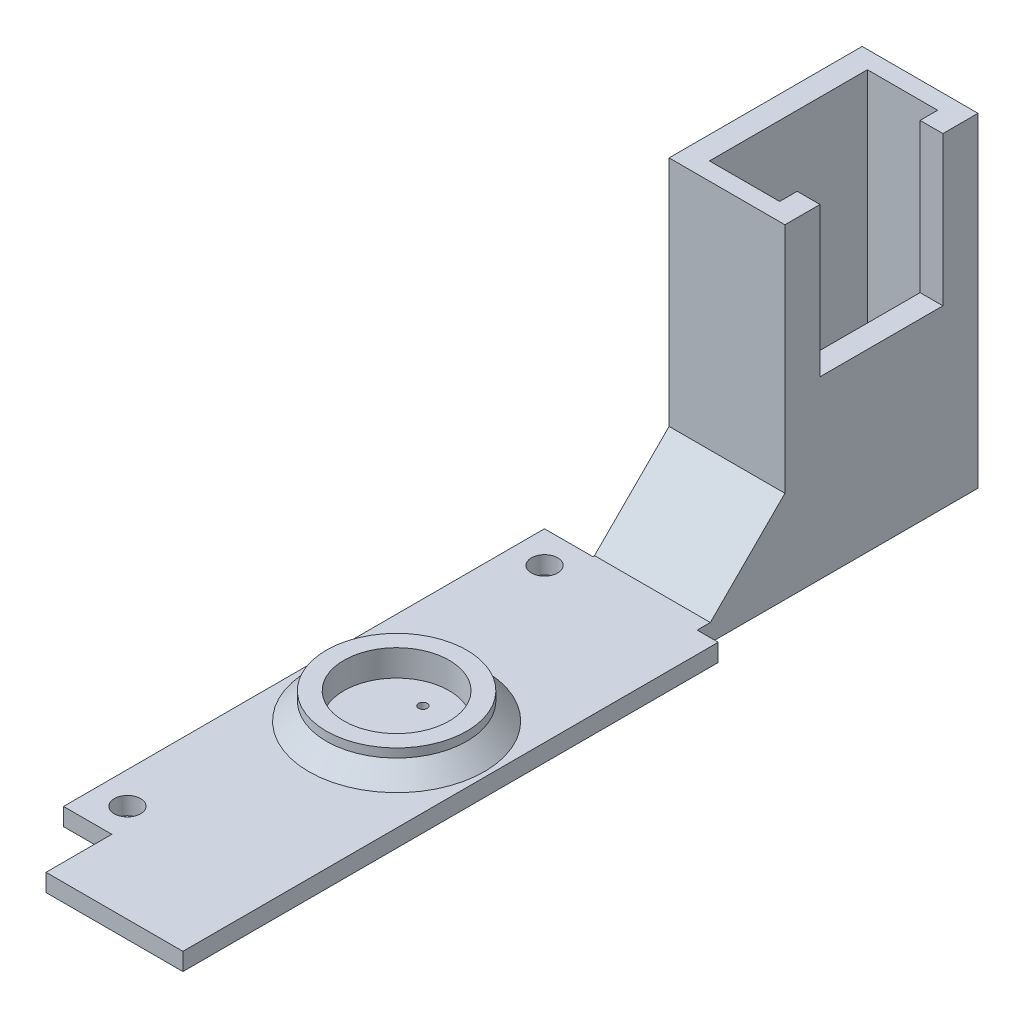
ISO-10303-21;
HEADER;
FILE_DESCRIPTION(('STEP AP214'),'2;1');
FILE_NAME('part.step','',(''),(''),'','','');
FILE_SCHEMA(('AUTOMOTIVE_DESIGN { 1 0 10303 214 1 1 1 1 }'));
ENDSEC;
DATA;
#1=APPLICATION_CONTEXT('core data for automotive mechanical design processes');
#2=APPLICATION_PROTOCOL_DEFINITION('international standard','automotive_design',2000,#1);
#3=PRODUCT_CONTEXT('',#1,'mechanical');
#4=PRODUCT('Part','Part','',(#3));
#5=PRODUCT_RELATED_PRODUCT_CATEGORY('part','',(#4));
#6=PRODUCT_DEFINITION_FORMATION('','',#4);
#7=PRODUCT_DEFINITION_CONTEXT('part definition',#1,'design');
#8=PRODUCT_DEFINITION('design','',#6,#7);
#9=PRODUCT_DEFINITION_SHAPE('','',#8);
#10=(LENGTH_UNIT() NAMED_UNIT(*) SI_UNIT(.MILLI.,.METRE.));
#11=(NAMED_UNIT(*) PLANE_ANGLE_UNIT() SI_UNIT($,.RADIAN.));
#12=(NAMED_UNIT(*) SI_UNIT($,.STERADIAN.) SOLID_ANGLE_UNIT());
#13=UNCERTAINTY_MEASURE_WITH_UNIT(LENGTH_MEASURE(1.E-05),#10,'distance_accuracy_value','');
#14=(GEOMETRIC_REPRESENTATION_CONTEXT(3) GLOBAL_UNCERTAINTY_ASSIGNED_CONTEXT((#13)) GLOBAL_UNIT_ASSIGNED_CONTEXT((#10,
#11,#12)) REPRESENTATION_CONTEXT('',''));
#15=CARTESIAN_POINT('',(0.,0.,0.));
#16=DIRECTION('',(0.,0.,1.));
#17=DIRECTION('',(1.,0.,0.));
#18=AXIS2_PLACEMENT_3D('',#15,#16,#17);
#19=CARTESIAN_POINT('',(0.,23.5,0.));
#20=DIRECTION('',(0.,1.,0.));
#21=DIRECTION('',(0.,0.,1.));
#22=AXIS2_PLACEMENT_3D('',#19,#20,#21);
#23=PLANE('',#22);
#24=CARTESIAN_POINT('',(-54.95,23.5,-6.40000000000002));
#25=DIRECTION('',(0.,1.,0.));
#26=DIRECTION('',(0.,0.,-1.));
#27=AXIS2_PLACEMENT_3D('',#24,#25,#26);
#28=CIRCLE('',#27,0.499999999999999);
#29=CARTESIAN_POINT('',(-54.95,23.5,-6.90000000000002));
#30=VERTEX_POINT('',#29);
#31=EDGE_CURVE('E562',#30,#30,#28,.T.);
#32=ORIENTED_EDGE('',*,*,#31,.F.);
#33=EDGE_LOOP('',(#32));
#34=FACE_BOUND('',#33,.T.);
#35=CARTESIAN_POINT('',(-54.95,23.5,-12.4));
#36=DIRECTION('',(0.,1.,0.));
#37=DIRECTION('',(0.,0.,1.));
#38=AXIS2_PLACEMENT_3D('',#35,#36,#37);
#39=CIRCLE('',#38,0.499999999999999);
#40=CARTESIAN_POINT('',(-54.95,23.5,-11.9));
#41=VERTEX_POINT('',#40);
#42=EDGE_CURVE('E561',#41,#41,#39,.T.);
#43=ORIENTED_EDGE('',*,*,#42,.F.);
#44=EDGE_LOOP('',(#43));
#45=FACE_BOUND('',#44,.T.);
#46=CARTESIAN_POINT('',(-54.95,23.5,-9.40000000000002));
#47=DIRECTION('',(0.,1.,0.));
#48=DIRECTION('',(0.,0.,1.));
#49=AXIS2_PLACEMENT_3D('',#46,#47,#48);
#50=CIRCLE('',#49,6.);
#51=CARTESIAN_POINT('',(-54.95,23.5,-3.40000000000002));
#52=VERTEX_POINT('',#51);
#53=EDGE_CURVE('E386',#52,#52,#50,.F.);
#54=ORIENTED_EDGE('',*,*,#53,.F.);
#55=EDGE_LOOP('',(#54));
#56=FACE_BOUND('',#55,.T.);
#57=ADVANCED_FACE('F39',(#34,#45,#56),#23,.T.);
#58=DIRECTION('',(1.,0.,0.));
#59=VECTOR('',#58,1.);
#60=CARTESIAN_POINT('',(-57.4,23.5,-50.5));
#61=LINE('',#60,#59);
#62=CARTESIAN_POINT('',(-57.4,23.5,-50.5));
#63=VERTEX_POINT('',#62);
#64=CARTESIAN_POINT('',(-49.4,23.5,-50.5));
#65=VERTEX_POINT('',#64);
#66=EDGE_CURVE('E237',#63,#65,#61,.T.);
#67=ORIENTED_EDGE('',*,*,#66,.F.);
#68=DIRECTION('',(0.,0.,1.));
#69=VECTOR('',#68,1.);
#70=CARTESIAN_POINT('',(-57.4,23.5,-65.5));
#71=LINE('',#70,#69);
#72=CARTESIAN_POINT('',(-57.4,23.5,-47.5));
#73=VERTEX_POINT('',#72);
#74=EDGE_CURVE('E262',#63,#73,#71,.T.);
#75=ORIENTED_EDGE('',*,*,#74,.T.);
#76=DIRECTION('',(1.,0.,0.));
#77=VECTOR('',#76,1.);
#78=CARTESIAN_POINT('',(-53.4,23.5,-47.5));
#79=LINE('',#78,#77);
#80=CARTESIAN_POINT('',(-49.4,23.5,-47.5));
#81=VERTEX_POINT('',#80);
#82=EDGE_CURVE('E266',#73,#81,#79,.T.);
#83=ORIENTED_EDGE('',*,*,#82,.T.);
#84=DIRECTION('',(0.,0.,-1.));
#85=VECTOR('',#84,1.);
#86=CARTESIAN_POINT('',(-49.4,23.5,-65.5));
#87=LINE('',#86,#85);
#88=EDGE_CURVE('E259',#81,#65,#87,.T.);
#89=ORIENTED_EDGE('',*,*,#88,.T.);
#90=EDGE_LOOP('',(#67,#75,#83,#89));
#91=FACE_BOUND('',#90,.T.);
#92=ADVANCED_FACE('F404',(#91),#23,.T.);
#93=CARTESIAN_POINT('',(44.8,21.5,-42.5));
#94=DIRECTION('',(0.,-1.,0.));
#95=DIRECTION('',(0.,0.,-1.));
#96=AXIS2_PLACEMENT_3D('',#93,#94,#95);
#97=PLANE('',#96);
#98=CARTESIAN_POINT('',(-54.95,21.5,-12.4));
#99=DIRECTION('',(0.,-1.,0.));
#100=DIRECTION('',(0.,0.,-1.));
#101=AXIS2_PLACEMENT_3D('',#98,#99,#100);
#102=CIRCLE('',#101,0.499999999999999);
#103=CARTESIAN_POINT('',(-54.95,21.5,-12.9));
#104=VERTEX_POINT('',#103);
#105=EDGE_CURVE('E542',#104,#104,#102,.T.);
#106=ORIENTED_EDGE('',*,*,#105,.F.);
#107=EDGE_LOOP('',(#106));
#108=FACE_BOUND('',#107,.T.);
#109=CARTESIAN_POINT('',(-54.95,21.5,-6.40000000000002));
#110=DIRECTION('',(0.,-1.,0.));
#111=DIRECTION('',(0.,0.,-1.));
#112=AXIS2_PLACEMENT_3D('',#109,#110,#111);
#113=CIRCLE('',#112,0.499999999999999);
#114=CARTESIAN_POINT('',(-54.95,21.5,-6.90000000000002));
#115=VERTEX_POINT('',#114);
#116=EDGE_CURVE('E558',#115,#115,#113,.T.);
#117=ORIENTED_EDGE('',*,*,#116,.F.);
#118=EDGE_LOOP('',(#117));
#119=FACE_BOUND('',#118,.T.);
#120=DIRECTION('',(0.,0.,-1.));
#121=VECTOR('',#120,1.);
#122=CARTESIAN_POINT('',(-57.4,21.5,-42.5));
#123=LINE('',#122,#121);
#124=CARTESIAN_POINT('',(-57.4,21.5,-50.5));
#125=VERTEX_POINT('',#124);
#126=CARTESIAN_POINT('',(-57.4,21.5,-62.5));
#127=VERTEX_POINT('',#126);
#128=EDGE_CURVE('E377',#125,#127,#123,.T.);
#129=ORIENTED_EDGE('',*,*,#128,.F.);
#130=DIRECTION('',(-1.,0.,0.));
#131=VECTOR('',#130,1.);
#132=CARTESIAN_POINT('',(44.8,21.5,-50.5));
#133=LINE('',#132,#131);
#134=CARTESIAN_POINT('',(-49.4,21.5,-50.5));
#135=VERTEX_POINT('',#134);
#136=EDGE_CURVE('E291',#135,#125,#133,.T.);
#137=ORIENTED_EDGE('',*,*,#136,.F.);
#138=DIRECTION('',(0.,0.,1.));
#139=VECTOR('',#138,1.);
#140=CARTESIAN_POINT('',(-49.4,21.5,-42.5));
#141=LINE('',#140,#139);
#142=CARTESIAN_POINT('',(-49.4,21.5,-62.5));
#143=VERTEX_POINT('',#142);
#144=EDGE_CURVE('E372',#143,#135,#141,.T.);
#145=ORIENTED_EDGE('',*,*,#144,.F.);
#146=DIRECTION('',(1.,0.,0.));
#147=VECTOR('',#146,1.);
#148=CARTESIAN_POINT('',(44.8,21.5,-62.5));
#149=LINE('',#148,#147);
#150=EDGE_CURVE('E375',#127,#143,#149,.T.);
#151=ORIENTED_EDGE('',*,*,#150,.F.);
#152=EDGE_LOOP('',(#129,#137,#145,#151));
#153=FACE_BOUND('',#152,.T.);
#154=DIRECTION('',(1.,0.,0.));
#155=VECTOR('',#154,1.);
#156=CARTESIAN_POINT('',(-65.5,21.5,18.));
#157=LINE('',#156,#155);
#158=CARTESIAN_POINT('',(-65.5,21.5,18.));
#159=VERTEX_POINT('',#158);
#160=CARTESIAN_POINT('',(-60.,21.5,18.));
#161=VERTEX_POINT('',#160);
#162=EDGE_CURVE('E305',#159,#161,#157,.T.);
#163=ORIENTED_EDGE('',*,*,#162,.F.);
#164=DIRECTION('',(0.,0.,1.));
#165=VECTOR('',#164,1.);
#166=CARTESIAN_POINT('',(-65.5,21.5,-36.8));
#167=LINE('',#166,#165);
#168=CARTESIAN_POINT('',(-65.5,21.5,-36.8));
#169=VERTEX_POINT('',#168);
#170=EDGE_CURVE('E316',#169,#159,#167,.T.);
#171=ORIENTED_EDGE('',*,*,#170,.F.);
#172=DIRECTION('',(-1.,0.,0.));
#173=VECTOR('',#172,1.);
#174=CARTESIAN_POINT('',(-60.,21.5,-36.8));
#175=LINE('',#174,#173);
#176=CARTESIAN_POINT('',(-60.,21.5,-36.8));
#177=VERTEX_POINT('',#176);
#178=EDGE_CURVE('E314',#177,#169,#175,.T.);
#179=ORIENTED_EDGE('',*,*,#178,.F.);
#180=DIRECTION('',(0.,0.,1.));
#181=VECTOR('',#180,1.);
#182=CARTESIAN_POINT('',(-60.,21.5,-67.5));
#183=LINE('',#182,#181);
#184=CARTESIAN_POINT('',(-60.,21.5,-67.5));
#185=VERTEX_POINT('',#184);
#186=EDGE_CURVE('E312',#185,#177,#183,.T.);
#187=ORIENTED_EDGE('',*,*,#186,.F.);
#188=DIRECTION('',(-1.,0.,0.));
#189=VECTOR('',#188,1.);
#190=CARTESIAN_POINT('',(-55.3,21.5,-67.5));
#191=LINE('',#190,#189);
#192=CARTESIAN_POINT('',(-46.8,21.5,-67.5));
#193=VERTEX_POINT('',#192);
#194=EDGE_CURVE('E310',#193,#185,#191,.T.);
#195=ORIENTED_EDGE('',*,*,#194,.F.);
#196=DIRECTION('',(0.,0.,1.));
#197=VECTOR('',#196,1.);
#198=CARTESIAN_POINT('',(-46.8,21.5,-62.8));
#199=LINE('',#198,#197);
#200=CARTESIAN_POINT('',(-46.8,21.5,-35.5));
#201=VERTEX_POINT('',#200);
#202=EDGE_CURVE('E295',#193,#201,#199,.T.);
#203=ORIENTED_EDGE('',*,*,#202,.T.);
#204=DIRECTION('',(-1.,0.,0.));
#205=VECTOR('',#204,1.);
#206=CARTESIAN_POINT('',(-44.4,21.5,-35.5));
#207=LINE('',#206,#205);
#208=CARTESIAN_POINT('',(-44.4,21.5,-35.5));
#209=VERTEX_POINT('',#208);
#210=EDGE_CURVE('E299',#209,#201,#207,.T.);
#211=ORIENTED_EDGE('',*,*,#210,.F.);
#212=DIRECTION('',(0.,0.,-1.));
#213=VECTOR('',#212,1.);
#214=CARTESIAN_POINT('',(-44.4,21.5,-29.3));
#215=LINE('',#214,#213);
#216=CARTESIAN_POINT('',(-44.4,21.5,25.5));
#217=VERTEX_POINT('',#216);
#218=EDGE_CURVE('E303',#217,#209,#215,.T.);
#219=ORIENTED_EDGE('',*,*,#218,.F.);
#220=DIRECTION('',(1.,0.,0.));
#221=VECTOR('',#220,1.);
#222=CARTESIAN_POINT('',(-16.9,21.5,25.5));
#223=LINE('',#222,#221);
#224=CARTESIAN_POINT('',(-60.,21.5,25.5));
#225=VERTEX_POINT('',#224);
#226=EDGE_CURVE('E296',#225,#217,#223,.T.);
#227=ORIENTED_EDGE('',*,*,#226,.F.);
#228=DIRECTION('',(0.,0.,1.));
#229=VECTOR('',#228,1.);
#230=CARTESIAN_POINT('',(-60.,21.5,18.));
#231=LINE('',#230,#229);
#232=EDGE_CURVE('E307',#161,#225,#231,.T.);
#233=ORIENTED_EDGE('',*,*,#232,.F.);
#234=EDGE_LOOP('',(#163,#171,#179,#187,#195,#203,#211,#219,#227,#233));
#235=FACE_BOUND('',#234,.T.);
#236=CARTESIAN_POINT('',(-61.8792707762021,21.5,-33.1911439682998));
#237=DIRECTION('',(0.,1.,0.));
#238=DIRECTION('',(0.,0.,1.));
#239=AXIS2_PLACEMENT_3D('',#236,#237,#238);
#240=CIRCLE('',#239,1.5);
#241=CARTESIAN_POINT('',(-61.8792707762021,21.5,-31.6911439682998));
#242=VERTEX_POINT('',#241);
#243=EDGE_CURVE('E292',#242,#242,#240,.T.);
#244=ORIENTED_EDGE('',*,*,#243,.T.);
#245=EDGE_LOOP('',(#244));
#246=FACE_BOUND('',#245,.T.);
#247=CARTESIAN_POINT('',(-61.8792707762021,21.5,14.3376182989599));
#248=DIRECTION('',(0.,1.,0.));
#249=DIRECTION('',(0.,0.,1.));
#250=AXIS2_PLACEMENT_3D('',#247,#248,#249);
#251=CIRCLE('',#250,1.5);
#252=CARTESIAN_POINT('',(-61.8792707762021,21.5,15.8376182989599));
#253=VERTEX_POINT('',#252);
#254=EDGE_CURVE('E288',#253,#253,#251,.T.);
#255=ORIENTED_EDGE('',*,*,#254,.T.);
#256=EDGE_LOOP('',(#255));
#257=FACE_BOUND('',#256,.T.);
#258=ADVANCED_FACE('F413',(#108,#119,#153,#235,#246,#257),#97,.T.);
#259=CARTESIAN_POINT('',(-60.,23.5,-67.5));
#260=DIRECTION('',(1.,0.,0.));
#261=DIRECTION('',(0.,0.,-1.));
#262=AXIS2_PLACEMENT_3D('',#259,#260,#261);
#263=PLANE('',#262);
#264=ORIENTED_EDGE('',*,*,#186,.T.);
#265=DIRECTION('',(0.,-1.,0.));
#266=VECTOR('',#265,1.);
#267=CARTESIAN_POINT('',(-60.,23.5,-36.8));
#268=LINE('',#267,#266);
#269=CARTESIAN_POINT('',(-60.,23.5,-36.8));
#270=VERTEX_POINT('',#269);
#271=EDGE_CURVE('E366',#270,#177,#268,.T.);
#272=ORIENTED_EDGE('',*,*,#271,.F.);
#273=DIRECTION('',(0.,0.,1.));
#274=VECTOR('',#273,1.);
#275=CARTESIAN_POINT('',(-60.,23.5,-67.5));
#276=LINE('',#275,#274);
#277=CARTESIAN_POINT('',(-60.,23.5,-37.0000000000001));
#278=VERTEX_POINT('',#277);
#279=EDGE_CURVE('E324',#278,#270,#276,.T.);
#280=ORIENTED_EDGE('',*,*,#279,.F.);
#281=DIRECTION('',(0.,0.707106781186552,-0.707106781186543));
#282=VECTOR('',#281,1.);
#283=CARTESIAN_POINT('',(-60.,38.75,-52.2499999999999));
#284=LINE('',#283,#282);
#285=CARTESIAN_POINT('',(-60.,32.0000000000001,-45.5));
#286=VERTEX_POINT('',#285);
#287=EDGE_CURVE('E384',#278,#286,#284,.T.);
#288=ORIENTED_EDGE('',*,*,#287,.T.);
#289=DIRECTION('',(0.,-1.,0.));
#290=VECTOR('',#289,1.);
#291=CARTESIAN_POINT('',(-60.,41.5,-45.5));
#292=LINE('',#291,#290);
#293=CARTESIAN_POINT('',(-60.,58.5,-45.5));
#294=VERTEX_POINT('',#293);
#295=EDGE_CURVE('E284',#294,#286,#292,.T.);
#296=ORIENTED_EDGE('',*,*,#295,.F.);
#297=DIRECTION('',(0.,0.,1.));
#298=VECTOR('',#297,1.);
#299=CARTESIAN_POINT('',(-60.,58.5,-67.5));
#300=LINE('',#299,#298);
#301=CARTESIAN_POINT('',(-60.,58.5,-67.5));
#302=VERTEX_POINT('',#301);
#303=EDGE_CURVE('E521',#302,#294,#300,.T.);
#304=ORIENTED_EDGE('',*,*,#303,.F.);
#305=DIRECTION('',(0.,-1.,0.));
#306=VECTOR('',#305,1.);
#307=CARTESIAN_POINT('',(-60.,23.5,-67.5));
#308=LINE('',#307,#306);
#309=EDGE_CURVE('E300',#302,#185,#308,.T.);
#310=ORIENTED_EDGE('',*,*,#309,.T.);
#311=EDGE_LOOP('',(#264,#272,#280,#288,#296,#304,#310));
#312=FACE_BOUND('',#311,.T.);
#313=ADVANCED_FACE('F433',(#312),#263,.F.);
#314=CARTESIAN_POINT('',(-65.5,23.5,18.));
#315=DIRECTION('',(0.,0.,-1.));
#316=DIRECTION('',(-1.,0.,0.));
#317=AXIS2_PLACEMENT_3D('',#314,#315,#316);
#318=PLANE('',#317);
#319=ORIENTED_EDGE('',*,*,#162,.T.);
#320=DIRECTION('',(0.,-1.,0.));
#321=VECTOR('',#320,1.);
#322=CARTESIAN_POINT('',(-60.,23.5,18.));
#323=LINE('',#322,#321);
#324=CARTESIAN_POINT('',(-60.,23.5,18.));
#325=VERTEX_POINT('',#324);
#326=EDGE_CURVE('E357',#325,#161,#323,.T.);
#327=ORIENTED_EDGE('',*,*,#326,.F.);
#328=DIRECTION('',(1.,0.,0.));
#329=VECTOR('',#328,1.);
#330=CARTESIAN_POINT('',(-65.5,23.5,18.));
#331=LINE('',#330,#329);
#332=CARTESIAN_POINT('',(-65.5,23.5,18.));
#333=VERTEX_POINT('',#332);
#334=EDGE_CURVE('E330',#333,#325,#331,.T.);
#335=ORIENTED_EDGE('',*,*,#334,.F.);
#336=DIRECTION('',(0.,-1.,0.));
#337=VECTOR('',#336,1.);
#338=CARTESIAN_POINT('',(-65.5,23.5,18.));
#339=LINE('',#338,#337);
#340=EDGE_CURVE('E360',#333,#159,#339,.T.);
#341=ORIENTED_EDGE('',*,*,#340,.T.);
#342=EDGE_LOOP('',(#319,#327,#335,#341));
#343=FACE_BOUND('',#342,.T.);
#344=ADVANCED_FACE('F478',(#343),#318,.F.);
#345=CARTESIAN_POINT('',(-65.5,23.5,-36.8));
#346=DIRECTION('',(1.,0.,0.));
#347=DIRECTION('',(0.,0.,-1.));
#348=AXIS2_PLACEMENT_3D('',#345,#346,#347);
#349=PLANE('',#348);
#350=ORIENTED_EDGE('',*,*,#170,.T.);
#351=ORIENTED_EDGE('',*,*,#340,.F.);
#352=DIRECTION('',(0.,0.,1.));
#353=VECTOR('',#352,1.);
#354=CARTESIAN_POINT('',(-65.5,23.5,-36.8));
#355=LINE('',#354,#353);
#356=CARTESIAN_POINT('',(-65.5,23.5,-36.8));
#357=VERTEX_POINT('',#356);
#358=EDGE_CURVE('E328',#357,#333,#355,.T.);
#359=ORIENTED_EDGE('',*,*,#358,.F.);
#360=DIRECTION('',(0.,-1.,0.));
#361=VECTOR('',#360,1.);
#362=CARTESIAN_POINT('',(-65.5,23.5,-36.8));
#363=LINE('',#362,#361);
#364=EDGE_CURVE('E363',#357,#169,#363,.T.);
#365=ORIENTED_EDGE('',*,*,#364,.T.);
#366=EDGE_LOOP('',(#350,#351,#359,#365));
#367=FACE_BOUND('',#366,.T.);
#368=ADVANCED_FACE('F471',(#367),#349,.F.);
#369=CARTESIAN_POINT('',(-44.4,23.5,25.5));
#370=DIRECTION('',(0.,0.,-1.));
#371=DIRECTION('',(-1.,0.,0.));
#372=AXIS2_PLACEMENT_3D('',#369,#370,#371);
#373=PLANE('',#372);
#374=DIRECTION('',(0.,-1.,0.));
#375=VECTOR('',#374,1.);
#376=CARTESIAN_POINT('',(-60.,23.5,25.5));
#377=LINE('',#376,#375);
#378=CARTESIAN_POINT('',(-60.,23.5,25.5));
#379=VERTEX_POINT('',#378);
#380=EDGE_CURVE('E354',#379,#225,#377,.T.);
#381=ORIENTED_EDGE('',*,*,#380,.T.);
#382=ORIENTED_EDGE('',*,*,#226,.T.);
#383=DIRECTION('',(0.,-1.,0.));
#384=VECTOR('',#383,1.);
#385=CARTESIAN_POINT('',(-44.4,23.5,25.5));
#386=LINE('',#385,#384);
#387=CARTESIAN_POINT('',(-44.4,23.5,25.5));
#388=VERTEX_POINT('',#387);
#389=EDGE_CURVE('E351',#388,#217,#386,.T.);
#390=ORIENTED_EDGE('',*,*,#389,.F.);
#391=DIRECTION('',(1.,0.,0.));
#392=VECTOR('',#391,1.);
#393=CARTESIAN_POINT('',(-46.4,23.5,25.5));
#394=LINE('',#393,#392);
#395=EDGE_CURVE('E334',#379,#388,#394,.T.);
#396=ORIENTED_EDGE('',*,*,#395,.F.);
#397=EDGE_LOOP('',(#381,#382,#390,#396));
#398=FACE_BOUND('',#397,.T.);
#399=ADVANCED_FACE('F479',(#398),#373,.F.);
#400=CARTESIAN_POINT('',(-44.4,23.5,10.5));
#401=DIRECTION('',(-1.,0.,0.));
#402=DIRECTION('',(0.,0.,1.));
#403=AXIS2_PLACEMENT_3D('',#400,#401,#402);
#404=PLANE('',#403);
#405=ORIENTED_EDGE('',*,*,#389,.T.);
#406=ORIENTED_EDGE('',*,*,#218,.T.);
#407=DIRECTION('',(0.,-1.,0.));
#408=VECTOR('',#407,1.);
#409=CARTESIAN_POINT('',(-44.4,23.5,-35.5));
#410=LINE('',#409,#408);
#411=CARTESIAN_POINT('',(-44.4,23.5,-35.5));
#412=VERTEX_POINT('',#411);
#413=EDGE_CURVE('E348',#412,#209,#410,.T.);
#414=ORIENTED_EDGE('',*,*,#413,.F.);
#415=DIRECTION('',(0.,0.,-1.));
#416=VECTOR('',#415,1.);
#417=CARTESIAN_POINT('',(-44.4,23.5,10.5));
#418=LINE('',#417,#416);
#419=EDGE_CURVE('E336',#388,#412,#418,.T.);
#420=ORIENTED_EDGE('',*,*,#419,.F.);
#421=EDGE_LOOP('',(#405,#406,#414,#420));
#422=FACE_BOUND('',#421,.T.);
#423=ADVANCED_FACE('F435',(#422),#404,.F.);
#424=CARTESIAN_POINT('',(-46.8,23.5,-35.5));
#425=DIRECTION('',(0.,0.,1.));
#426=DIRECTION('',(1.,0.,0.));
#427=AXIS2_PLACEMENT_3D('',#424,#425,#426);
#428=PLANE('',#427);
#429=ORIENTED_EDGE('',*,*,#210,.T.);
#430=DIRECTION('',(0.,-1.,0.));
#431=VECTOR('',#430,1.);
#432=CARTESIAN_POINT('',(-46.8,23.5,-35.5));
#433=LINE('',#432,#431);
#434=CARTESIAN_POINT('',(-46.8,23.5,-35.5));
#435=VERTEX_POINT('',#434);
#436=EDGE_CURVE('E345',#435,#201,#433,.T.);
#437=ORIENTED_EDGE('',*,*,#436,.F.);
#438=DIRECTION('',(-1.,0.,0.));
#439=VECTOR('',#438,1.);
#440=CARTESIAN_POINT('',(-46.8,23.5,-35.5));
#441=LINE('',#440,#439);
#442=EDGE_CURVE('E338',#412,#435,#441,.T.);
#443=ORIENTED_EDGE('',*,*,#442,.F.);
#444=ORIENTED_EDGE('',*,*,#413,.T.);
#445=EDGE_LOOP('',(#429,#437,#443,#444));
#446=FACE_BOUND('',#445,.T.);
#447=ADVANCED_FACE('F422',(#446),#428,.F.);
#448=CARTESIAN_POINT('',(-54.95,23.5,-9.40000000000002));
#449=DIRECTION('',(0.,1.,0.));
#450=DIRECTION('',(0.,0.,1.));
#451=AXIS2_PLACEMENT_3D('',#448,#449,#450);
#452=CIRCLE('',#451,9.99999999999998);
#453=CARTESIAN_POINT('',(-54.95,23.5,0.599999999999955));
#454=VERTEX_POINT('',#453);
#455=EDGE_CURVE('E11',#454,#454,#452,.F.);
#456=ORIENTED_EDGE('',*,*,#455,.T.);
#457=EDGE_LOOP('',(#456));
#458=FACE_BOUND('',#457,.T.);
#459=DIRECTION('',(0.,0.,-1.));
#460=VECTOR('',#459,1.);
#461=CARTESIAN_POINT('',(-46.8,23.5,-62.8));
#462=LINE('',#461,#460);
#463=CARTESIAN_POINT('',(-46.8,23.5,-37.0000000000001));
#464=VERTEX_POINT('',#463);
#465=EDGE_CURVE('E340',#435,#464,#462,.T.);
#466=ORIENTED_EDGE('',*,*,#465,.T.);
#467=DIRECTION('',(-1.,0.,0.));
#468=VECTOR('',#467,1.);
#469=CARTESIAN_POINT('',(0.,23.5,-37.0000000000001));
#470=LINE('',#469,#468);
#471=EDGE_CURVE('E62',#464,#278,#470,.T.);
#472=ORIENTED_EDGE('',*,*,#471,.T.);
#473=ORIENTED_EDGE('',*,*,#279,.T.);
#474=DIRECTION('',(-1.,0.,0.));
#475=VECTOR('',#474,1.);
#476=CARTESIAN_POINT('',(-60.,23.5,-36.8));
#477=LINE('',#476,#475);
#478=EDGE_CURVE('E326',#270,#357,#477,.T.);
#479=ORIENTED_EDGE('',*,*,#478,.T.);
#480=ORIENTED_EDGE('',*,*,#358,.T.);
#481=ORIENTED_EDGE('',*,*,#334,.T.);
#482=DIRECTION('',(0.,0.,1.));
#483=VECTOR('',#482,1.);
#484=CARTESIAN_POINT('',(-60.,23.5,25.5));
#485=LINE('',#484,#483);
#486=EDGE_CURVE('E332',#325,#379,#485,.T.);
#487=ORIENTED_EDGE('',*,*,#486,.T.);
#488=ORIENTED_EDGE('',*,*,#395,.T.);
#489=ORIENTED_EDGE('',*,*,#419,.T.);
#490=ORIENTED_EDGE('',*,*,#442,.T.);
#491=EDGE_LOOP('',(#466,#472,#473,#479,#480,#481,#487,#488,#489,#490));
#492=FACE_BOUND('',#491,.T.);
#493=CARTESIAN_POINT('',(-61.8792707762021,23.5,14.3376182989599));
#494=DIRECTION('',(0.,1.,0.));
#495=DIRECTION('',(0.,0.,1.));
#496=AXIS2_PLACEMENT_3D('',#493,#494,#495);
#497=CIRCLE('',#496,1.5);
#498=CARTESIAN_POINT('',(-61.8792707762021,23.5,15.8376182989599));
#499=VERTEX_POINT('',#498);
#500=EDGE_CURVE('E321',#499,#499,#497,.T.);
#501=ORIENTED_EDGE('',*,*,#500,.F.);
#502=EDGE_LOOP('',(#501));
#503=FACE_BOUND('',#502,.T.);
#504=CARTESIAN_POINT('',(-61.8792707762021,23.5,-33.1911439682998));
#505=DIRECTION('',(0.,1.,0.));
#506=DIRECTION('',(0.,0.,1.));
#507=AXIS2_PLACEMENT_3D('',#504,#505,#506);
#508=CIRCLE('',#507,1.5);
#509=CARTESIAN_POINT('',(-61.8792707762021,23.5,-31.6911439682998));
#510=VERTEX_POINT('',#509);
#511=EDGE_CURVE('E287',#510,#510,#508,.T.);
#512=ORIENTED_EDGE('',*,*,#511,.F.);
#513=EDGE_LOOP('',(#512));
#514=FACE_BOUND('',#513,.T.);
#515=ADVANCED_FACE('F407',(#458,#492,#503,#514),#23,.T.);
#516=CARTESIAN_POINT('',(-46.8,23.5,-67.5));
#517=DIRECTION('',(0.,0.,1.));
#518=DIRECTION('',(1.,0.,0.));
#519=AXIS2_PLACEMENT_3D('',#516,#517,#518);
#520=PLANE('',#519);
#521=DIRECTION('',(0.,-1.,0.));
#522=VECTOR('',#521,1.);
#523=CARTESIAN_POINT('',(-46.8,23.5,-67.5));
#524=LINE('',#523,#522);
#525=CARTESIAN_POINT('',(-46.8,58.5,-67.5));
#526=VERTEX_POINT('',#525);
#527=EDGE_CURVE('E342',#526,#193,#524,.T.);
#528=ORIENTED_EDGE('',*,*,#527,.T.);
#529=ORIENTED_EDGE('',*,*,#194,.T.);
#530=ORIENTED_EDGE('',*,*,#309,.F.);
#531=DIRECTION('',(-1.,0.,0.));
#532=VECTOR('',#531,1.);
#533=CARTESIAN_POINT('',(-46.8,58.5,-67.5));
#534=LINE('',#533,#532);
#535=EDGE_CURVE('E525',#526,#302,#534,.T.);
#536=ORIENTED_EDGE('',*,*,#535,.F.);
#537=EDGE_LOOP('',(#528,#529,#530,#536));
#538=FACE_BOUND('',#537,.T.);
#539=ADVANCED_FACE('F421',(#538),#520,.F.);
#540=CARTESIAN_POINT('',(-46.8,23.5,-62.8));
#541=DIRECTION('',(-1.,0.,0.));
#542=DIRECTION('',(0.,0.,1.));
#543=AXIS2_PLACEMENT_3D('',#540,#541,#542);
#544=PLANE('',#543);
#545=ORIENTED_EDGE('',*,*,#436,.T.);
#546=ORIENTED_EDGE('',*,*,#202,.F.);
#547=ORIENTED_EDGE('',*,*,#527,.F.);
#548=DIRECTION('',(0.,0.,-1.));
#549=VECTOR('',#548,1.);
#550=CARTESIAN_POINT('',(-46.8,58.5,-63.5));
#551=LINE('',#550,#549);
#552=CARTESIAN_POINT('',(-46.8,58.5,-63.5));
#553=VERTEX_POINT('',#552);
#554=EDGE_CURVE('E219',#553,#526,#551,.T.);
#555=ORIENTED_EDGE('',*,*,#554,.F.);
#556=DIRECTION('',(0.,-1.,0.));
#557=VECTOR('',#556,1.);
#558=CARTESIAN_POINT('',(-46.8,58.5,-63.5));
#559=LINE('',#558,#557);
#560=CARTESIAN_POINT('',(-46.8,41.5,-63.5));
#561=VERTEX_POINT('',#560);
#562=EDGE_CURVE('E215',#553,#561,#559,.T.);
#563=ORIENTED_EDGE('',*,*,#562,.T.);
#564=DIRECTION('',(0.,0.,-1.));
#565=VECTOR('',#564,1.);
#566=CARTESIAN_POINT('',(-46.8,41.5,-67.5));
#567=LINE('',#566,#565);
#568=CARTESIAN_POINT('',(-46.8,41.5,-49.5));
#569=VERTEX_POINT('',#568);
#570=EDGE_CURVE('E280',#569,#561,#567,.T.);
#571=ORIENTED_EDGE('',*,*,#570,.F.);
#572=DIRECTION('',(0.,-1.,0.));
#573=VECTOR('',#572,1.);
#574=CARTESIAN_POINT('',(-46.8,58.5,-49.5));
#575=LINE('',#574,#573);
#576=CARTESIAN_POINT('',(-46.8,58.5,-49.5));
#577=VERTEX_POINT('',#576);
#578=EDGE_CURVE('E242',#577,#569,#575,.T.);
#579=ORIENTED_EDGE('',*,*,#578,.F.);
#580=DIRECTION('',(0.,0.,-1.));
#581=VECTOR('',#580,1.);
#582=CARTESIAN_POINT('',(-46.8,58.5,-49.5));
#583=LINE('',#582,#581);
#584=CARTESIAN_POINT('',(-46.8,58.5,-45.5));
#585=VERTEX_POINT('',#584);
#586=EDGE_CURVE('E520',#585,#577,#583,.T.);
#587=ORIENTED_EDGE('',*,*,#586,.F.);
#588=DIRECTION('',(0.,-1.,0.));
#589=VECTOR('',#588,1.);
#590=CARTESIAN_POINT('',(-46.8,41.5,-45.5));
#591=LINE('',#590,#589);
#592=CARTESIAN_POINT('',(-46.8,32.0000000000001,-45.5));
#593=VERTEX_POINT('',#592);
#594=EDGE_CURVE('E282',#585,#593,#591,.T.);
#595=ORIENTED_EDGE('',*,*,#594,.T.);
#596=DIRECTION('',(0.,-0.707106781186552,0.707106781186543));
#597=VECTOR('',#596,1.);
#598=CARTESIAN_POINT('',(-46.8,36.4,-49.8999999999999));
#599=LINE('',#598,#597);
#600=EDGE_CURVE('E55',#593,#464,#599,.T.);
#601=ORIENTED_EDGE('',*,*,#600,.T.);
#602=ORIENTED_EDGE('',*,*,#465,.F.);
#603=EDGE_LOOP('',(#545,#546,#547,#555,#563,#571,#579,#587,#595,#601,#602));
#604=FACE_BOUND('',#603,.T.);
#605=ADVANCED_FACE('F430',(#604),#544,.F.);
#606=CARTESIAN_POINT('',(-60.,23.5,25.5));
#607=DIRECTION('',(1.,0.,0.));
#608=DIRECTION('',(0.,0.,-1.));
#609=AXIS2_PLACEMENT_3D('',#606,#607,#608);
#610=PLANE('',#609);
#611=ORIENTED_EDGE('',*,*,#232,.T.);
#612=ORIENTED_EDGE('',*,*,#380,.F.);
#613=ORIENTED_EDGE('',*,*,#486,.F.);
#614=ORIENTED_EDGE('',*,*,#326,.T.);
#615=EDGE_LOOP('',(#611,#612,#613,#614));
#616=FACE_BOUND('',#615,.T.);
#617=ADVANCED_FACE('F468',(#616),#610,.F.);
#618=CARTESIAN_POINT('',(-60.,23.5,-36.8));
#619=DIRECTION('',(0.,0.,1.));
#620=DIRECTION('',(1.,0.,0.));
#621=AXIS2_PLACEMENT_3D('',#618,#619,#620);
#622=PLANE('',#621);
#623=ORIENTED_EDGE('',*,*,#178,.T.);
#624=ORIENTED_EDGE('',*,*,#364,.F.);
#625=ORIENTED_EDGE('',*,*,#478,.F.);
#626=ORIENTED_EDGE('',*,*,#271,.T.);
#627=EDGE_LOOP('',(#623,#624,#625,#626));
#628=FACE_BOUND('',#627,.T.);
#629=ADVANCED_FACE('F463',(#628),#622,.F.);
#630=CARTESIAN_POINT('',(-61.8792707762021,23.5,14.3376182989599));
#631=DIRECTION('',(0.,-1.,0.));
#632=DIRECTION('',(0.,0.,-1.));
#633=AXIS2_PLACEMENT_3D('',#630,#631,#632);
#634=CYLINDRICAL_SURFACE('',#633,1.5);
#635=ORIENTED_EDGE('',*,*,#500,.T.);
#636=EDGE_LOOP('',(#635));
#637=FACE_BOUND('',#636,.T.);
#638=ORIENTED_EDGE('',*,*,#254,.F.);
#639=EDGE_LOOP('',(#638));
#640=FACE_BOUND('',#639,.T.);
#641=ADVANCED_FACE('F454',(#637,#640),#634,.F.);
#642=CARTESIAN_POINT('',(-61.8792707762021,23.5,-33.1911439682998));
#643=DIRECTION('',(0.,-1.,0.));
#644=DIRECTION('',(0.,0.,-1.));
#645=AXIS2_PLACEMENT_3D('',#642,#643,#644);
#646=CYLINDRICAL_SURFACE('',#645,1.5);
#647=ORIENTED_EDGE('',*,*,#511,.T.);
#648=EDGE_LOOP('',(#647));
#649=FACE_BOUND('',#648,.T.);
#650=ORIENTED_EDGE('',*,*,#243,.F.);
#651=EDGE_LOOP('',(#650));
#652=FACE_BOUND('',#651,.T.);
#653=ADVANCED_FACE('F443',(#649,#652),#646,.F.);
#654=CARTESIAN_POINT('',(0.,41.5,0.));
#655=DIRECTION('',(0.,1.,0.));
#656=DIRECTION('',(0.,0.,1.));
#657=AXIS2_PLACEMENT_3D('',#654,#655,#656);
#658=PLANE('',#657);
#659=DIRECTION('',(-1.,0.,0.));
#660=VECTOR('',#659,1.);
#661=CARTESIAN_POINT('',(-49.4,41.5,-49.5));
#662=LINE('',#661,#660);
#663=CARTESIAN_POINT('',(-49.4,41.5,-49.5));
#664=VERTEX_POINT('',#663);
#665=EDGE_CURVE('E230',#569,#664,#662,.T.);
#666=ORIENTED_EDGE('',*,*,#665,.F.);
#667=ORIENTED_EDGE('',*,*,#570,.T.);
#668=DIRECTION('',(1.,0.,0.));
#669=VECTOR('',#668,1.);
#670=CARTESIAN_POINT('',(-49.4,41.5,-63.5));
#671=LINE('',#670,#669);
#672=CARTESIAN_POINT('',(-49.4,41.5,-63.5));
#673=VERTEX_POINT('',#672);
#674=EDGE_CURVE('E540',#673,#561,#671,.T.);
#675=ORIENTED_EDGE('',*,*,#674,.F.);
#676=DIRECTION('',(0.,0.,-1.));
#677=VECTOR('',#676,1.);
#678=CARTESIAN_POINT('',(-49.4,41.5,-65.5));
#679=LINE('',#678,#677);
#680=EDGE_CURVE('E236',#664,#673,#679,.T.);
#681=ORIENTED_EDGE('',*,*,#680,.F.);
#682=EDGE_LOOP('',(#666,#667,#675,#681));
#683=FACE_BOUND('',#682,.T.);
#684=ADVANCED_FACE('F424',(#683),#658,.T.);
#685=CARTESIAN_POINT('',(-60.,41.5,-45.5));
#686=DIRECTION('',(0.,0.,-1.));
#687=DIRECTION('',(-1.,0.,0.));
#688=AXIS2_PLACEMENT_3D('',#685,#686,#687);
#689=PLANE('',#688);
#690=ORIENTED_EDGE('',*,*,#295,.T.);
#691=DIRECTION('',(1.,0.,0.));
#692=VECTOR('',#691,1.);
#693=CARTESIAN_POINT('',(-60.,32.0000000000001,-45.5));
#694=LINE('',#693,#692);
#695=EDGE_CURVE('E379',#286,#593,#694,.T.);
#696=ORIENTED_EDGE('',*,*,#695,.T.);
#697=ORIENTED_EDGE('',*,*,#594,.F.);
#698=DIRECTION('',(1.,0.,0.));
#699=VECTOR('',#698,1.);
#700=CARTESIAN_POINT('',(-60.,58.5,-45.5));
#701=LINE('',#700,#699);
#702=EDGE_CURVE('E518',#294,#585,#701,.T.);
#703=ORIENTED_EDGE('',*,*,#702,.F.);
#704=EDGE_LOOP('',(#690,#696,#697,#703));
#705=FACE_BOUND('',#704,.T.);
#706=ADVANCED_FACE('F442',(#705),#689,.F.);
#707=CARTESIAN_POINT('',(-53.4,41.5,-65.5));
#708=DIRECTION('',(0.,0.,1.));
#709=DIRECTION('',(1.,0.,0.));
#710=AXIS2_PLACEMENT_3D('',#707,#708,#709);
#711=PLANE('',#710);
#712=DIRECTION('',(-1.,0.,0.));
#713=VECTOR('',#712,1.);
#714=CARTESIAN_POINT('',(-53.4,23.5,-65.5));
#715=LINE('',#714,#713);
#716=CARTESIAN_POINT('',(-49.4,23.5,-65.5));
#717=VERTEX_POINT('',#716);
#718=CARTESIAN_POINT('',(-57.4,23.5,-65.5));
#719=VERTEX_POINT('',#718);
#720=EDGE_CURVE('E251',#717,#719,#715,.T.);
#721=ORIENTED_EDGE('',*,*,#720,.F.);
#722=DIRECTION('',(0.,-1.,0.));
#723=VECTOR('',#722,1.);
#724=CARTESIAN_POINT('',(-49.4,41.5,-65.5));
#725=LINE('',#724,#723);
#726=CARTESIAN_POINT('',(-49.4,58.5,-65.5));
#727=VERTEX_POINT('',#726);
#728=EDGE_CURVE('E258',#727,#717,#725,.T.);
#729=ORIENTED_EDGE('',*,*,#728,.F.);
#730=DIRECTION('',(1.,0.,0.));
#731=VECTOR('',#730,1.);
#732=CARTESIAN_POINT('',(-57.4,58.5,-65.5));
#733=LINE('',#732,#731);
#734=CARTESIAN_POINT('',(-57.4,58.5,-65.5));
#735=VERTEX_POINT('',#734);
#736=EDGE_CURVE('E227',#735,#727,#733,.T.);
#737=ORIENTED_EDGE('',*,*,#736,.F.);
#738=DIRECTION('',(0.,-1.,0.));
#739=VECTOR('',#738,1.);
#740=CARTESIAN_POINT('',(-57.4,41.5,-65.5));
#741=LINE('',#740,#739);
#742=EDGE_CURVE('E278',#735,#719,#741,.T.);
#743=ORIENTED_EDGE('',*,*,#742,.T.);
#744=EDGE_LOOP('',(#721,#729,#737,#743));
#745=FACE_BOUND('',#744,.T.);
#746=ADVANCED_FACE('F450',(#745),#711,.T.);
#747=CARTESIAN_POINT('',(-57.4,41.5,-65.5));
#748=DIRECTION('',(1.,0.,0.));
#749=DIRECTION('',(0.,0.,-1.));
#750=AXIS2_PLACEMENT_3D('',#747,#748,#749);
#751=PLANE('',#750);
#752=CARTESIAN_POINT('',(-57.4,23.5,-62.5));
#753=VERTEX_POINT('',#752);
#754=EDGE_CURVE('E263',#719,#753,#71,.T.);
#755=ORIENTED_EDGE('',*,*,#754,.F.);
#756=ORIENTED_EDGE('',*,*,#742,.F.);
#757=DIRECTION('',(0.,0.,-1.));
#758=VECTOR('',#757,1.);
#759=CARTESIAN_POINT('',(-57.4,58.5,-47.5));
#760=LINE('',#759,#758);
#761=CARTESIAN_POINT('',(-57.4,58.5,-47.5));
#762=VERTEX_POINT('',#761);
#763=EDGE_CURVE('E536',#762,#735,#760,.T.);
#764=ORIENTED_EDGE('',*,*,#763,.F.);
#765=DIRECTION('',(0.,-1.,0.));
#766=VECTOR('',#765,1.);
#767=CARTESIAN_POINT('',(-57.4,41.5,-47.5));
#768=LINE('',#767,#766);
#769=EDGE_CURVE('E275',#762,#73,#768,.T.);
#770=ORIENTED_EDGE('',*,*,#769,.T.);
#771=ORIENTED_EDGE('',*,*,#74,.F.);
#772=DIRECTION('',(0.,1.,0.));
#773=VECTOR('',#772,1.);
#774=CARTESIAN_POINT('',(-57.4,-2.5,-50.5));
#775=LINE('',#774,#773);
#776=EDGE_CURVE('E248',#125,#63,#775,.T.);
#777=ORIENTED_EDGE('',*,*,#776,.F.);
#778=ORIENTED_EDGE('',*,*,#128,.T.);
#779=DIRECTION('',(0.,1.,0.));
#780=VECTOR('',#779,1.);
#781=CARTESIAN_POINT('',(-57.4,-2.5,-62.5));
#782=LINE('',#781,#780);
#783=EDGE_CURVE('E249',#127,#753,#782,.T.);
#784=ORIENTED_EDGE('',*,*,#783,.T.);
#785=EDGE_LOOP('',(#755,#756,#764,#770,#771,#777,#778,#784));
#786=FACE_BOUND('',#785,.T.);
#787=ADVANCED_FACE('F601',(#786),#751,.T.);
#788=CARTESIAN_POINT('',(-53.4,41.5,-47.5));
#789=DIRECTION('',(0.,0.,-1.));
#790=DIRECTION('',(-1.,0.,0.));
#791=AXIS2_PLACEMENT_3D('',#788,#789,#790);
#792=PLANE('',#791);
#793=ORIENTED_EDGE('',*,*,#82,.F.);
#794=ORIENTED_EDGE('',*,*,#769,.F.);
#795=DIRECTION('',(-1.,0.,0.));
#796=VECTOR('',#795,1.);
#797=CARTESIAN_POINT('',(-49.4,58.5,-47.5));
#798=LINE('',#797,#796);
#799=CARTESIAN_POINT('',(-49.4,58.5,-47.5));
#800=VERTEX_POINT('',#799);
#801=EDGE_CURVE('E533',#800,#762,#798,.T.);
#802=ORIENTED_EDGE('',*,*,#801,.F.);
#803=DIRECTION('',(0.,-1.,0.));
#804=VECTOR('',#803,1.);
#805=CARTESIAN_POINT('',(-49.4,41.5,-47.5));
#806=LINE('',#805,#804);
#807=EDGE_CURVE('E273',#800,#81,#806,.T.);
#808=ORIENTED_EDGE('',*,*,#807,.T.);
#809=EDGE_LOOP('',(#793,#794,#802,#808));
#810=FACE_BOUND('',#809,.T.);
#811=ADVANCED_FACE('F599',(#810),#792,.T.);
#812=CARTESIAN_POINT('',(-49.4,41.5,-65.5));
#813=DIRECTION('',(-1.,0.,0.));
#814=DIRECTION('',(0.,0.,1.));
#815=AXIS2_PLACEMENT_3D('',#812,#813,#814);
#816=PLANE('',#815);
#817=ORIENTED_EDGE('',*,*,#88,.F.);
#818=ORIENTED_EDGE('',*,*,#807,.F.);
#819=DIRECTION('',(0.,0.,1.));
#820=VECTOR('',#819,1.);
#821=CARTESIAN_POINT('',(-49.4,58.5,-49.5));
#822=LINE('',#821,#820);
#823=CARTESIAN_POINT('',(-49.4,58.5,-49.5));
#824=VERTEX_POINT('',#823);
#825=EDGE_CURVE('E530',#824,#800,#822,.T.);
#826=ORIENTED_EDGE('',*,*,#825,.F.);
#827=DIRECTION('',(0.,-1.,0.));
#828=VECTOR('',#827,1.);
#829=CARTESIAN_POINT('',(-49.4,58.5,-49.5));
#830=LINE('',#829,#828);
#831=EDGE_CURVE('E539',#824,#664,#830,.T.);
#832=ORIENTED_EDGE('',*,*,#831,.T.);
#833=ORIENTED_EDGE('',*,*,#680,.T.);
#834=DIRECTION('',(0.,-1.,0.));
#835=VECTOR('',#834,1.);
#836=CARTESIAN_POINT('',(-49.4,58.5,-63.5));
#837=LINE('',#836,#835);
#838=CARTESIAN_POINT('',(-49.4,58.5,-63.5));
#839=VERTEX_POINT('',#838);
#840=EDGE_CURVE('E213',#839,#673,#837,.T.);
#841=ORIENTED_EDGE('',*,*,#840,.F.);
#842=DIRECTION('',(0.,0.,1.));
#843=VECTOR('',#842,1.);
#844=CARTESIAN_POINT('',(-49.4,58.5,-65.5));
#845=LINE('',#844,#843);
#846=EDGE_CURVE('E220',#727,#839,#845,.T.);
#847=ORIENTED_EDGE('',*,*,#846,.F.);
#848=ORIENTED_EDGE('',*,*,#728,.T.);
#849=CARTESIAN_POINT('',(-49.4,23.5,-62.5));
#850=VERTEX_POINT('',#849);
#851=EDGE_CURVE('E269',#850,#717,#87,.T.);
#852=ORIENTED_EDGE('',*,*,#851,.F.);
#853=DIRECTION('',(0.,1.,0.));
#854=VECTOR('',#853,1.);
#855=CARTESIAN_POINT('',(-49.4,-2.5,-62.5));
#856=LINE('',#855,#854);
#857=EDGE_CURVE('E252',#143,#850,#856,.T.);
#858=ORIENTED_EDGE('',*,*,#857,.F.);
#859=ORIENTED_EDGE('',*,*,#144,.T.);
#860=DIRECTION('',(0.,1.,0.));
#861=VECTOR('',#860,1.);
#862=CARTESIAN_POINT('',(-49.4,-2.5,-50.5));
#863=LINE('',#862,#861);
#864=EDGE_CURVE('E254',#135,#65,#863,.T.);
#865=ORIENTED_EDGE('',*,*,#864,.T.);
#866=EDGE_LOOP('',(#817,#818,#826,#832,#833,#841,#847,#848,#852,#858,#859,#865));
#867=FACE_BOUND('',#866,.T.);
#868=ADVANCED_FACE('F234',(#867),#816,.T.);
#869=DIRECTION('',(-1.,0.,0.));
#870=VECTOR('',#869,1.);
#871=CARTESIAN_POINT('',(-57.4,23.5,-62.5));
#872=LINE('',#871,#870);
#873=EDGE_CURVE('E240',#850,#753,#872,.T.);
#874=ORIENTED_EDGE('',*,*,#873,.F.);
#875=ORIENTED_EDGE('',*,*,#851,.T.);
#876=ORIENTED_EDGE('',*,*,#720,.T.);
#877=ORIENTED_EDGE('',*,*,#754,.T.);
#878=EDGE_LOOP('',(#874,#875,#876,#877));
#879=FACE_BOUND('',#878,.T.);
#880=ADVANCED_FACE('F415',(#879),#23,.T.);
#881=CARTESIAN_POINT('',(-57.4,-2.5,-62.5));
#882=DIRECTION('',(0.,0.,-1.));
#883=DIRECTION('',(-1.,0.,0.));
#884=AXIS2_PLACEMENT_3D('',#881,#882,#883);
#885=PLANE('',#884);
#886=ORIENTED_EDGE('',*,*,#150,.T.);
#887=ORIENTED_EDGE('',*,*,#857,.T.);
#888=ORIENTED_EDGE('',*,*,#873,.T.);
#889=ORIENTED_EDGE('',*,*,#783,.F.);
#890=EDGE_LOOP('',(#886,#887,#888,#889));
#891=FACE_BOUND('',#890,.T.);
#892=ADVANCED_FACE('F439',(#891),#885,.F.);
#893=CARTESIAN_POINT('',(-57.4,-2.5,-50.5));
#894=DIRECTION('',(0.,0.,1.));
#895=DIRECTION('',(1.,0.,0.));
#896=AXIS2_PLACEMENT_3D('',#893,#894,#895);
#897=PLANE('',#896);
#898=ORIENTED_EDGE('',*,*,#136,.T.);
#899=ORIENTED_EDGE('',*,*,#776,.T.);
#900=ORIENTED_EDGE('',*,*,#66,.T.);
#901=ORIENTED_EDGE('',*,*,#864,.F.);
#902=EDGE_LOOP('',(#898,#899,#900,#901));
#903=FACE_BOUND('',#902,.T.);
#904=ADVANCED_FACE('F590',(#903),#897,.F.);
#905=CARTESIAN_POINT('',(-49.4,58.5,-63.5));
#906=DIRECTION('',(0.,0.,-1.));
#907=DIRECTION('',(-1.,0.,0.));
#908=AXIS2_PLACEMENT_3D('',#905,#906,#907);
#909=PLANE('',#908);
#910=ORIENTED_EDGE('',*,*,#674,.T.);
#911=ORIENTED_EDGE('',*,*,#562,.F.);
#912=DIRECTION('',(1.,0.,0.));
#913=VECTOR('',#912,1.);
#914=CARTESIAN_POINT('',(-49.4,58.5,-63.5));
#915=LINE('',#914,#913);
#916=EDGE_CURVE('E208',#839,#553,#915,.T.);
#917=ORIENTED_EDGE('',*,*,#916,.F.);
#918=ORIENTED_EDGE('',*,*,#840,.T.);
#919=EDGE_LOOP('',(#910,#911,#917,#918));
#920=FACE_BOUND('',#919,.T.);
#921=ADVANCED_FACE('F211',(#920),#909,.F.);
#922=CARTESIAN_POINT('',(-49.4,58.5,-49.5));
#923=DIRECTION('',(0.,0.,1.));
#924=DIRECTION('',(1.,0.,0.));
#925=AXIS2_PLACEMENT_3D('',#922,#923,#924);
#926=PLANE('',#925);
#927=ORIENTED_EDGE('',*,*,#665,.T.);
#928=ORIENTED_EDGE('',*,*,#831,.F.);
#929=DIRECTION('',(-1.,0.,0.));
#930=VECTOR('',#929,1.);
#931=CARTESIAN_POINT('',(-49.4,58.5,-49.5));
#932=LINE('',#931,#930);
#933=EDGE_CURVE('E523',#577,#824,#932,.T.);
#934=ORIENTED_EDGE('',*,*,#933,.F.);
#935=ORIENTED_EDGE('',*,*,#578,.T.);
#936=EDGE_LOOP('',(#927,#928,#934,#935));
#937=FACE_BOUND('',#936,.T.);
#938=ADVANCED_FACE('F509',(#937),#926,.F.);
#939=CARTESIAN_POINT('',(0.,58.5,0.));
#940=DIRECTION('',(0.,1.,0.));
#941=DIRECTION('',(0.,0.,1.));
#942=AXIS2_PLACEMENT_3D('',#939,#940,#941);
#943=PLANE('',#942);
#944=ORIENTED_EDGE('',*,*,#846,.T.);
#945=ORIENTED_EDGE('',*,*,#916,.T.);
#946=ORIENTED_EDGE('',*,*,#554,.T.);
#947=ORIENTED_EDGE('',*,*,#535,.T.);
#948=ORIENTED_EDGE('',*,*,#303,.T.);
#949=ORIENTED_EDGE('',*,*,#702,.T.);
#950=ORIENTED_EDGE('',*,*,#586,.T.);
#951=ORIENTED_EDGE('',*,*,#933,.T.);
#952=ORIENTED_EDGE('',*,*,#825,.T.);
#953=ORIENTED_EDGE('',*,*,#801,.T.);
#954=ORIENTED_EDGE('',*,*,#763,.T.);
#955=ORIENTED_EDGE('',*,*,#736,.T.);
#956=EDGE_LOOP('',(#944,#945,#946,#947,#948,#949,#950,#951,#952,#953,#954,#955));
#957=FACE_BOUND('',#956,.T.);
#958=ADVANCED_FACE('F224',(#957),#943,.T.);
#959=CARTESIAN_POINT('',(-60.,32.0000000000001,-45.5));
#960=DIRECTION('',(0.,-0.707106781186543,-0.707106781186551));
#961=DIRECTION('',(1.,0.,0.));
#962=AXIS2_PLACEMENT_3D('',#959,#960,#961);
#963=PLANE('',#962);
#964=ORIENTED_EDGE('',*,*,#287,.F.);
#965=ORIENTED_EDGE('',*,*,#471,.F.);
#966=ORIENTED_EDGE('',*,*,#600,.F.);
#967=ORIENTED_EDGE('',*,*,#695,.F.);
#968=EDGE_LOOP('',(#964,#965,#966,#967));
#969=FACE_BOUND('',#968,.T.);
#970=ADVANCED_FACE('F496',(#969),#963,.F.);
#971=CARTESIAN_POINT('',(-54.95,6.5,-6.40000000000002));
#972=DIRECTION('',(0.,1.,0.));
#973=DIRECTION('',(0.,0.,1.));
#974=AXIS2_PLACEMENT_3D('',#971,#972,#973);
#975=CYLINDRICAL_SURFACE('',#974,0.499999999999999);
#976=ORIENTED_EDGE('',*,*,#116,.T.);
#977=EDGE_LOOP('',(#976));
#978=FACE_BOUND('',#977,.T.);
#979=ORIENTED_EDGE('',*,*,#31,.T.);
#980=EDGE_LOOP('',(#979));
#981=FACE_BOUND('',#980,.T.);
#982=ADVANCED_FACE('F500',(#978,#981),#975,.F.);
#983=CARTESIAN_POINT('',(-54.95,6.5,-12.4));
#984=DIRECTION('',(0.,1.,0.));
#985=DIRECTION('',(0.,0.,1.));
#986=AXIS2_PLACEMENT_3D('',#983,#984,#985);
#987=CYLINDRICAL_SURFACE('',#986,0.499999999999999);
#988=ORIENTED_EDGE('',*,*,#105,.T.);
#989=EDGE_LOOP('',(#988));
#990=FACE_BOUND('',#989,.T.);
#991=ORIENTED_EDGE('',*,*,#42,.T.);
#992=EDGE_LOOP('',(#991));
#993=FACE_BOUND('',#992,.T.);
#994=ADVANCED_FACE('F506',(#990,#993),#987,.F.);
#995=CARTESIAN_POINT('',(-54.95,26.5,-9.40000000000002));
#996=DIRECTION('',(0.,1.,0.));
#997=DIRECTION('',(0.,0.,1.));
#998=AXIS2_PLACEMENT_3D('',#995,#996,#997);
#999=PLANE('',#998);
#1000=CARTESIAN_POINT('',(-54.95,26.5,-9.40000000000002));
#1001=DIRECTION('',(0.,1.,0.));
#1002=DIRECTION('',(0.,0.,1.));
#1003=AXIS2_PLACEMENT_3D('',#1000,#1001,#1002);
#1004=CIRCLE('',#1003,8.);
#1005=CARTESIAN_POINT('',(-54.95,26.5,-1.40000000000002));
#1006=VERTEX_POINT('',#1005);
#1007=EDGE_CURVE('E565',#1006,#1006,#1004,.T.);
#1008=ORIENTED_EDGE('',*,*,#1007,.T.);
#1009=EDGE_LOOP('',(#1008));
#1010=FACE_BOUND('',#1009,.T.);
#1011=CARTESIAN_POINT('',(-54.95,26.5,-9.40000000000002));
#1012=DIRECTION('',(0.,1.,0.));
#1013=DIRECTION('',(0.,0.,1.));
#1014=AXIS2_PLACEMENT_3D('',#1011,#1012,#1013);
#1015=CIRCLE('',#1014,6.);
#1016=CARTESIAN_POINT('',(-54.95,26.5,-3.40000000000002));
#1017=VERTEX_POINT('',#1016);
#1018=EDGE_CURVE('E570',#1017,#1017,#1015,.T.);
#1019=ORIENTED_EDGE('',*,*,#1018,.F.);
#1020=EDGE_LOOP('',(#1019));
#1021=FACE_BOUND('',#1020,.T.);
#1022=ADVANCED_FACE('F575',(#1010,#1021),#999,.T.);
#1023=CARTESIAN_POINT('',(-54.95,26.5,-9.40000000000002));
#1024=DIRECTION('',(0.,-1.,0.));
#1025=DIRECTION('',(0.,0.,-1.));
#1026=AXIS2_PLACEMENT_3D('',#1023,#1024,#1025);
#1027=CYLINDRICAL_SURFACE('',#1026,8.);
#1028=CARTESIAN_POINT('',(-54.95,25.5,-9.40000000000002));
#1029=DIRECTION('',(0.,1.,0.));
#1030=DIRECTION('',(0.,0.,1.));
#1031=AXIS2_PLACEMENT_3D('',#1028,#1029,#1030);
#1032=CIRCLE('',#1031,8.);
#1033=CARTESIAN_POINT('',(-54.95,25.5,-1.40000000000002));
#1034=VERTEX_POINT('',#1033);
#1035=EDGE_CURVE('E48',#1034,#1034,#1032,.T.);
#1036=ORIENTED_EDGE('',*,*,#1035,.T.);
#1037=EDGE_LOOP('',(#1036));
#1038=FACE_BOUND('',#1037,.T.);
#1039=ORIENTED_EDGE('',*,*,#1007,.F.);
#1040=EDGE_LOOP('',(#1039));
#1041=FACE_BOUND('',#1040,.T.);
#1042=ADVANCED_FACE('F391',(#1038,#1041),#1027,.T.);
#1043=CARTESIAN_POINT('',(-54.95,26.5,-9.40000000000002));
#1044=DIRECTION('',(0.,-1.,0.));
#1045=DIRECTION('',(0.,0.,-1.));
#1046=AXIS2_PLACEMENT_3D('',#1043,#1044,#1045);
#1047=CYLINDRICAL_SURFACE('',#1046,6.);
#1048=ORIENTED_EDGE('',*,*,#1018,.T.);
#1049=EDGE_LOOP('',(#1048));
#1050=FACE_BOUND('',#1049,.T.);
#1051=ORIENTED_EDGE('',*,*,#53,.T.);
#1052=EDGE_LOOP('',(#1051));
#1053=FACE_BOUND('',#1052,.T.);
#1054=ADVANCED_FACE('F395',(#1050,#1053),#1047,.F.);
#1055=CARTESIAN_POINT('',(-54.95,25.5,-9.40000000000002));
#1056=DIRECTION('',(0.,-1.,0.));
#1057=DIRECTION('',(0.,0.,-1.));
#1058=AXIS2_PLACEMENT_3D('',#1055,#1056,#1057);
#1059=CONICAL_SURFACE('',#1058,8.,0.785398163397441);
#1060=ORIENTED_EDGE('',*,*,#455,.F.);
#1061=EDGE_LOOP('',(#1060));
#1062=FACE_BOUND('',#1061,.T.);
#1063=ORIENTED_EDGE('',*,*,#1035,.F.);
#1064=EDGE_LOOP('',(#1063));
#1065=FACE_BOUND('',#1064,.T.);
#1066=ADVANCED_FACE('F42',(#1062,#1065),#1059,.T.);
#1067=CLOSED_SHELL('',(#57,#92,#258,#313,#344,#368,#399,#423,#447,#515,#539,#605,#617,#629,#641,
#653,#684,#706,#746,#787,#811,#868,#880,#892,#904,#921,#938,#958,#970,#982,#994,#1022,#1042,
#1054,#1066));
#1068=MANIFOLD_SOLID_BREP('B2',#1067);
#1069=ADVANCED_BREP_SHAPE_REPRESENTATION('',(#18,#1068),#14);
#1070=SHAPE_DEFINITION_REPRESENTATION(#9,#1069);
ENDSEC;
END-ISO-10303-21;
